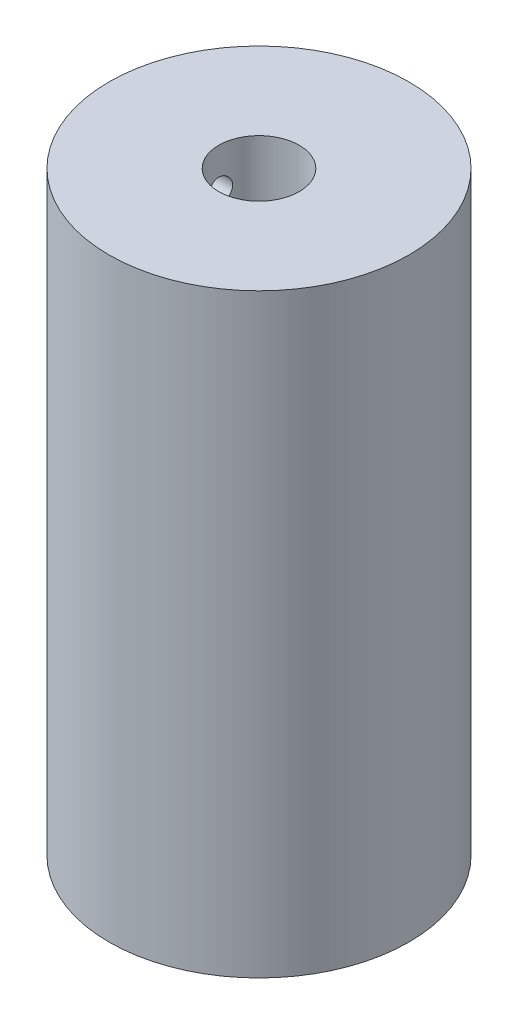
ISO-10303-21;
HEADER;
FILE_DESCRIPTION(('STEP AP214'),'2;1');
FILE_NAME('part.step','',(''),(''),'','','');
FILE_SCHEMA(('AUTOMOTIVE_DESIGN { 1 0 10303 214 1 1 1 1 }'));
ENDSEC;
DATA;
#1=APPLICATION_CONTEXT('core data for automotive mechanical design processes');
#2=APPLICATION_PROTOCOL_DEFINITION('international standard','automotive_design',2000,#1);
#3=PRODUCT_CONTEXT('',#1,'mechanical');
#4=PRODUCT('Part','Part','',(#3));
#5=PRODUCT_RELATED_PRODUCT_CATEGORY('part','',(#4));
#6=PRODUCT_DEFINITION_FORMATION('','',#4);
#7=PRODUCT_DEFINITION_CONTEXT('part definition',#1,'design');
#8=PRODUCT_DEFINITION('design','',#6,#7);
#9=PRODUCT_DEFINITION_SHAPE('','',#8);
#10=(LENGTH_UNIT() NAMED_UNIT(*) SI_UNIT(.MILLI.,.METRE.));
#11=(NAMED_UNIT(*) PLANE_ANGLE_UNIT() SI_UNIT($,.RADIAN.));
#12=(NAMED_UNIT(*) SI_UNIT($,.STERADIAN.) SOLID_ANGLE_UNIT());
#13=UNCERTAINTY_MEASURE_WITH_UNIT(LENGTH_MEASURE(1.E-05),#10,'distance_accuracy_value','');
#14=(GEOMETRIC_REPRESENTATION_CONTEXT(3) GLOBAL_UNCERTAINTY_ASSIGNED_CONTEXT((#13)) GLOBAL_UNIT_ASSIGNED_CONTEXT((#10,
#11,#12)) REPRESENTATION_CONTEXT('',''));
#15=CARTESIAN_POINT('',(0.,0.,0.));
#16=DIRECTION('',(0.,0.,1.));
#17=DIRECTION('',(1.,0.,0.));
#18=AXIS2_PLACEMENT_3D('',#15,#16,#17);
#19=CARTESIAN_POINT('',(0.,41.,0.));
#20=DIRECTION('',(0.,-1.,0.));
#21=DIRECTION('',(0.,0.,-1.));
#22=AXIS2_PLACEMENT_3D('',#19,#20,#21);
#23=CYLINDRICAL_SURFACE('',#22,18.6431118275312);
#24=CARTESIAN_POINT('',(-18.5826698462259,36.0595505754476,-1.5));
#25=CARTESIAN_POINT('',(-18.5826706482539,36.143659799444,-1.49999632137991));
#26=CARTESIAN_POINT('',(-18.5832470379523,36.2278265369809,-1.49290184275366));
#27=CARTESIAN_POINT('',(-18.5854903413188,36.3938319630162,-1.46470464510055));
#28=CARTESIAN_POINT('',(-18.587158495829,36.4756678918712,-1.44358598653252));
#29=CARTESIAN_POINT('',(-18.5913951726797,36.6345833119367,-1.38795450904475));
#30=CARTESIAN_POINT('',(-18.5939631899536,36.7116654428334,-1.35344920249707));
#31=CARTESIAN_POINT('',(-18.5997096077148,36.8589251913361,-1.27203709144946));
#32=CARTESIAN_POINT('',(-18.6028878762356,36.9291042967642,-1.2251329673618));
#33=CARTESIAN_POINT('',(-18.6095052645678,37.0607530816999,-1.12013272489978));
#34=CARTESIAN_POINT('',(-18.6129449253086,37.1222039013569,-1.06201299211818));
#35=CARTESIAN_POINT('',(-18.6196925704556,37.2344898018251,-0.936281172907927));
#36=CARTESIAN_POINT('',(-18.6230005491447,37.2853244221426,-0.86866867492895));
#37=CARTESIAN_POINT('',(-18.6291171823753,37.3749971150423,-0.725758796140489));
#38=CARTESIAN_POINT('',(-18.6319251589255,37.4138189503712,-0.65045119533237));
#39=CARTESIAN_POINT('',(-18.6367195899352,37.4782601953578,-0.494360160383457));
#40=CARTESIAN_POINT('',(-18.6387060579066,37.5038798221606,-0.413576816330362));
#41=CARTESIAN_POINT('',(-18.6416298746976,37.5411353361337,-0.249014502165849));
#42=CARTESIAN_POINT('',(-18.6425695044976,37.5528016306473,-0.165242457185388));
#43=CARTESIAN_POINT('',(-18.6433014975777,37.5619133017621,0.00307565414053751));
#44=CARTESIAN_POINT('',(-18.6430938808929,37.5593589267057,0.0876217069433936));
#45=CARTESIAN_POINT('',(-18.6415566588693,37.5401266670672,0.254881737795371));
#46=CARTESIAN_POINT('',(-18.6402296512523,37.5234814820957,0.337599502976665));
#47=CARTESIAN_POINT('',(-18.6366059152514,37.4765909279254,0.499063275024797));
#48=CARTESIAN_POINT('',(-18.6343091781731,37.446345436788,0.577809246273984));
#49=CARTESIAN_POINT('',(-18.6289999301283,37.3730762936281,0.729198319666572));
#50=CARTESIAN_POINT('',(-18.6259865981191,37.3300379699028,0.801834291053138));
#51=CARTESIAN_POINT('',(-18.6195828712088,37.2324155165484,0.938863662166564));
#52=CARTESIAN_POINT('',(-18.6161924691867,37.1778311688557,1.00325690618057));
#53=CARTESIAN_POINT('',(-18.6094043720801,37.0584817601215,1.12216407390732));
#54=CARTESIAN_POINT('',(-18.6060066835514,36.9936882901629,1.1766494874581));
#55=CARTESIAN_POINT('',(-18.5995966337125,36.8558589706978,1.27397415980091));
#56=CARTESIAN_POINT('',(-18.5965842726894,36.7828231150464,1.31681340991021));
#57=CARTESIAN_POINT('',(-18.5912853460401,36.6305625187955,1.38962847515776));
#58=CARTESIAN_POINT('',(-18.5889988614659,36.5513370882913,1.41960285392201));
#59=CARTESIAN_POINT('',(-18.5854120960407,36.388955618425,1.46581642733687));
#60=CARTESIAN_POINT('',(-18.5841117958798,36.3057996560581,1.4820558909232));
#61=CARTESIAN_POINT('',(-18.5826477073038,36.1381669693119,1.50030265205765));
#62=CARTESIAN_POINT('',(-18.5824807456246,36.0536945969481,1.50234968770205));
#63=CARTESIAN_POINT('',(-18.5832938599946,35.8856078664563,1.49225753729062));
#64=CARTESIAN_POINT('',(-18.584273926081,35.801993500882,1.48011847445325));
#65=CARTESIAN_POINT('',(-18.5872677707752,35.6381101048532,1.44203182040746));
#66=CARTESIAN_POINT('',(-18.5892801638049,35.5578367458734,1.41610273630597));
#67=CARTESIAN_POINT('',(-18.5941107592436,35.4027800192717,1.35119087442304));
#68=CARTESIAN_POINT('',(-18.5969289737191,35.3279967338805,1.31220790116839));
#69=CARTESIAN_POINT('',(-18.6030613588536,35.1858610251872,1.22219413633293));
#70=CARTESIAN_POINT('',(-18.6063766145796,35.1185254337821,1.17113684147485));
#71=CARTESIAN_POINT('',(-18.613125841605,34.9933665537291,1.0584620853356));
#72=CARTESIAN_POINT('',(-18.6165598148092,34.9355434178019,0.996844454542759));
#73=CARTESIAN_POINT('',(-18.6231689743024,34.8309154135654,0.864626510393533));
#74=CARTESIAN_POINT('',(-18.6263435434451,34.7841363480924,0.794005743401145));
#75=CARTESIAN_POINT('',(-18.6320673157884,34.7031013379563,0.64588824658906));
#76=CARTESIAN_POINT('',(-18.6346165248729,34.6688452754639,0.568391581473379));
#77=CARTESIAN_POINT('',(-18.6387994957251,34.6138730772188,0.408814963883985));
#78=CARTESIAN_POINT('',(-18.6404343398737,34.5931409276566,0.326740557485148));
#79=CARTESIAN_POINT('',(-18.642608762092,34.5657527157697,0.160262022317936));
#80=CARTESIAN_POINT('',(-18.6431483593481,34.559096406867,0.0758579343867362));
#81=CARTESIAN_POINT('',(-18.6430715244392,34.560051616264,-0.0926295457182753));
#82=CARTESIAN_POINT('',(-18.6424583524774,34.5676228967938,-0.176713170432667));
#83=CARTESIAN_POINT('',(-18.6401513327504,34.5967345282587,-0.342410624624078));
#84=CARTESIAN_POINT('',(-18.6384574834383,34.6182748991903,-0.424024450565437));
#85=CARTESIAN_POINT('',(-18.6341792091379,34.6747031896352,-0.582468688027212));
#86=CARTESIAN_POINT('',(-18.6315948272922,34.7095904625544,-0.659299331060584));
#87=CARTESIAN_POINT('',(-18.625824775805,34.7917175294604,-0.806019397857401));
#88=CARTESIAN_POINT('',(-18.6226391166075,34.8389571088973,-0.875908942153222));
#89=CARTESIAN_POINT('',(-18.6160134687475,34.9445987318563,-1.00696868451505));
#90=CARTESIAN_POINT('',(-18.6125728183109,35.0030304918337,-1.06811489574877));
#91=CARTESIAN_POINT('',(-18.6058305823151,35.1293454059802,-1.17975582310422));
#92=CARTESIAN_POINT('',(-18.6025290306893,35.1972308491985,-1.23024795205061));
#93=CARTESIAN_POINT('',(-18.5964324360478,35.3406493331855,-1.31921086920486));
#94=CARTESIAN_POINT('',(-18.5936383017349,35.4161957238111,-1.35766017815408));
#95=CARTESIAN_POINT('',(-18.5888840552651,35.5726424646262,-1.42127948705629));
#96=CARTESIAN_POINT('',(-18.5869229819554,35.6535365196248,-1.44646479857753));
#97=CARTESIAN_POINT('',(-18.5845627433914,35.7890172951672,-1.47640633492943));
#98=CARTESIAN_POINT('',(-18.5838561558402,35.8427319459284,-1.48524224814131));
#99=CARTESIAN_POINT('',(-18.5829094485435,35.95080657566,-1.49704026268811));
#100=CARTESIAN_POINT('',(-18.5826693276441,36.0051665530338,-1.50000237855194));
#101=CARTESIAN_POINT('',(-18.5826698462259,36.0595505754476,-1.5));
#102=B_SPLINE_CURVE_WITH_KNOTS('',3,(#24,#25,#26,#27,#28,#29,#30,#31,#32,#33,#34,#35,#36,#37,
#38,#39,#40,#41,#42,#43,#44,#45,#46,#47,#48,#49,#50,#51,#52,#53,#54,#55,#56,#57,#58,#59,#60,#61,
#62,#63,#64,#65,#66,#67,#68,#69,#70,#71,#72,#73,#74,#75,#76,#77,#78,#79,#80,#81,#82,#83,#84,#85,
#86,#87,#88,#89,#90,#91,#92,#93,#94,#95,#96,#97,#98,#99,#100,#101),.UNSPECIFIED.,.T.,.F.,(4,2,2,
2,2,2,2,2,2,2,2,2,2,2,2,2,2,2,2,2,2,2,2,2,2,2,2,2,2,2,2,2,2,2,2,2,2,2,4),(0.,0.252129110575319,
0.504545276543594,0.756819995032623,1.00904022058063,1.26179740580186,1.51456555246978,
1.76767387927873,2.02077804292404,2.27332962672719,2.52587680011592,2.77783950552403,
3.02980447004342,3.28205952770044,3.53431934998896,3.78729395325183,4.04026874511798,
4.29327177449526,4.54626984984662,4.79855925598449,5.05084647078838,5.30279595096958,
5.5547492040936,5.80726071654076,6.05977628261461,6.3128761013666,6.56597353863505,
6.81877073387677,7.07156350062688,7.32364240707507,7.57572167437185,7.82778873116729,
8.07985141004556,8.33259285981231,8.58539561338821,8.8386467250353,9.09160484669105,
9.25462892972958,9.41765260952585),.UNSPECIFIED.);
#103=CARTESIAN_POINT('',(-18.5826698462259,36.0595505754476,-1.5));
#104=VERTEX_POINT('',#103);
#105=EDGE_CURVE('E63',#104,#104,#102,.T.);
#106=ORIENTED_EDGE('',*,*,#105,.T.);
#107=EDGE_LOOP('',(#106));
#108=FACE_BOUND('',#107,.T.);
#109=CARTESIAN_POINT('',(0.,41.,0.));
#110=DIRECTION('',(0.,1.,0.));
#111=DIRECTION('',(0.,0.,1.));
#112=AXIS2_PLACEMENT_3D('',#109,#110,#111);
#113=CIRCLE('',#112,18.6431118275312);
#114=CARTESIAN_POINT('',(0.,41.,18.6431118275312));
#115=VERTEX_POINT('',#114);
#116=EDGE_CURVE('E10',#115,#115,#113,.T.);
#117=ORIENTED_EDGE('',*,*,#116,.F.);
#118=EDGE_LOOP('',(#117));
#119=FACE_BOUND('',#118,.T.);
#120=CARTESIAN_POINT('',(0.,-33.,0.));
#121=DIRECTION('',(0.,-1.,0.));
#122=DIRECTION('',(0.,0.,-1.));
#123=AXIS2_PLACEMENT_3D('',#120,#121,#122);
#124=CIRCLE('',#123,18.6431118275312);
#125=CARTESIAN_POINT('',(0.,-33.,-18.6431118275312));
#126=VERTEX_POINT('',#125);
#127=EDGE_CURVE('E64',#126,#126,#124,.T.);
#128=ORIENTED_EDGE('',*,*,#127,.F.);
#129=EDGE_LOOP('',(#128));
#130=FACE_BOUND('',#129,.T.);
#131=ADVANCED_FACE('F37',(#108,#119,#130),#23,.T.);
#132=CARTESIAN_POINT('',(0.,41.,0.));
#133=DIRECTION('',(0.,1.,0.));
#134=DIRECTION('',(0.,0.,1.));
#135=AXIS2_PLACEMENT_3D('',#132,#133,#134);
#136=PLANE('',#135);
#137=CARTESIAN_POINT('',(0.,41.,0.));
#138=DIRECTION('',(0.,1.,0.));
#139=DIRECTION('',(0.,0.,1.));
#140=AXIS2_PLACEMENT_3D('',#137,#138,#139);
#141=CIRCLE('',#140,5.);
#142=CARTESIAN_POINT('',(0.,41.,5.));
#143=VERTEX_POINT('',#142);
#144=EDGE_CURVE('E52',#143,#143,#141,.T.);
#145=ORIENTED_EDGE('',*,*,#144,.F.);
#146=EDGE_LOOP('',(#145));
#147=FACE_BOUND('',#146,.T.);
#148=ORIENTED_EDGE('',*,*,#116,.T.);
#149=EDGE_LOOP('',(#148));
#150=FACE_BOUND('',#149,.T.);
#151=ADVANCED_FACE('F108',(#147,#150),#136,.T.);
#152=CARTESIAN_POINT('',(0.,31.,0.));
#153=DIRECTION('',(0.,1.,0.));
#154=DIRECTION('',(0.,0.,1.));
#155=AXIS2_PLACEMENT_3D('',#152,#153,#154);
#156=CYLINDRICAL_SURFACE('',#155,5.);
#157=CARTESIAN_POINT('',(-4.76969600708473,36.0595505754476,-1.5));
#158=CARTESIAN_POINT('',(-4.7696968572698,35.9773560275052,-1.49999897633764));
#159=CARTESIAN_POINT('',(-4.77184390209069,35.8951513513035,-1.49322108167142));
#160=CARTESIAN_POINT('',(-4.780165783029,35.7331453258556,-1.46635844446749));
#161=CARTESIAN_POINT('',(-4.78634196493468,35.6533447889461,-1.44626925573578));
#162=CARTESIAN_POINT('',(-4.80196102485632,35.4985158471758,-1.39352753269955));
#163=CARTESIAN_POINT('',(-4.81139846703232,35.4234797458145,-1.36089589394243));
#164=CARTESIAN_POINT('',(-4.83246932547567,35.2799286414523,-1.28406421917929));
#165=CARTESIAN_POINT('',(-4.84410307041019,35.2114146167631,-1.23986245137053));
#166=CARTESIAN_POINT('',(-4.86866862185765,35.0806841848702,-1.13964754141627));
#167=CARTESIAN_POINT('',(-4.88162808311636,35.0187046775013,-1.08333207175807));
#168=CARTESIAN_POINT('',(-4.90714861936757,34.9049126241251,-0.9611362375796));
#169=CARTESIAN_POINT('',(-4.91970964297705,34.8531013849977,-0.895254645461112));
#170=CARTESIAN_POINT('',(-4.94333214579389,34.7600878756142,-0.75411143779369));
#171=CARTESIAN_POINT('',(-4.95435724342404,34.7191271510047,-0.678684021335814));
#172=CARTESIAN_POINT('',(-4.97334435920684,34.6505633164048,-0.521624645369353));
#173=CARTESIAN_POINT('',(-4.98130703789495,34.6229573255901,-0.439994028387912));
#174=CARTESIAN_POINT('',(-4.99307646003589,34.5826705743571,-0.27532385263083));
#175=CARTESIAN_POINT('',(-4.99699557369338,34.5695854477949,-0.1923913989538));
#176=CARTESIAN_POINT('',(-5.00063201501348,34.5574332508011,-0.0254218237493139));
#177=CARTESIAN_POINT('',(-5.00035022521079,34.5583632360456,0.0586150620503695));
#178=CARTESIAN_POINT('',(-4.99569603817658,34.5739434439906,0.222571156600162));
#179=CARTESIAN_POINT('',(-4.9914542020526,34.5881557692574,0.302536267641343));
#180=CARTESIAN_POINT('',(-4.97951522112593,34.6291819114418,0.458889213442527));
#181=CARTESIAN_POINT('',(-4.97181785750586,34.6559965263902,0.535276821322846));
#182=CARTESIAN_POINT('',(-4.95365220986963,34.7217625988661,0.683347326351281));
#183=CARTESIAN_POINT('',(-4.94315269676706,34.7608517782548,0.754965064694479));
#184=CARTESIAN_POINT('',(-4.92049640648069,34.8499484278758,0.890764673783157));
#185=CARTESIAN_POINT('',(-4.90833923637778,34.899958488411,0.954944774872132));
#186=CARTESIAN_POINT('',(-4.88311550488166,35.0117483261992,1.0766604815298));
#187=CARTESIAN_POINT('',(-4.87003195321461,35.0739074944773,1.13384458040112));
#188=CARTESIAN_POINT('',(-4.84483979887497,35.2070605933376,1.23707651539824));
#189=CARTESIAN_POINT('',(-4.8327312931702,35.2780554008368,1.28312324482852));
#190=CARTESIAN_POINT('',(-4.81077903197678,35.4277900446966,1.3631399533545));
#191=CARTESIAN_POINT('',(-4.80095810695957,35.5065976213105,1.39698989237679));
#192=CARTESIAN_POINT('',(-4.78496392548436,35.6691577838931,1.45083362878413));
#193=CARTESIAN_POINT('',(-4.7787894791583,35.7529087469821,1.4708319464056));
#194=CARTESIAN_POINT('',(-4.77104849541241,35.9196329361868,1.49574770282165));
#195=CARTESIAN_POINT('',(-4.7693187867044,36.0025187993415,1.50119946380212));
#196=CARTESIAN_POINT('',(-4.77021192441924,36.1680234754574,1.49835947233062));
#197=CARTESIAN_POINT('',(-4.77283416156589,36.2506423241784,1.4900696437133));
#198=CARTESIAN_POINT('',(-4.78197558554912,36.4110389534184,1.4604576357419));
#199=CARTESIAN_POINT('',(-4.78839176507489,36.4888867397111,1.4394796143128));
#200=CARTESIAN_POINT('',(-4.80429141231227,36.6399522662625,1.3854857774794));
#201=CARTESIAN_POINT('',(-4.81377535359073,36.7131692895881,1.3524681034276));
#202=CARTESIAN_POINT('',(-4.83505835023047,36.8550680395197,1.27431871196501));
#203=CARTESIAN_POINT('',(-4.84691271069799,36.9235752964333,1.22888564172729));
#204=CARTESIAN_POINT('',(-4.87148205646987,37.0521886816284,1.12755301600385));
#205=CARTESIAN_POINT('',(-4.88419724730003,37.1122927930603,1.07165095534897));
#206=CARTESIAN_POINT('',(-4.90963633548158,37.2247309812623,0.948455132493601));
#207=CARTESIAN_POINT('',(-4.92234245063004,37.2766862044345,0.880811065857436));
#208=CARTESIAN_POINT('',(-4.94584851748651,37.3685172764753,0.73746178459025));
#209=CARTESIAN_POINT('',(-4.95664856384717,37.408393725229,0.661756970543944));
#210=CARTESIAN_POINT('',(-4.97505970474957,37.4745506060159,0.504935504705222));
#211=CARTESIAN_POINT('',(-4.98269453424966,37.5009325916065,0.423864622037839));
#212=CARTESIAN_POINT('',(-4.99401979596827,37.539611494338,0.258169966504589));
#213=CARTESIAN_POINT('',(-4.9977113567088,37.551912441396,0.173547217354763));
#214=CARTESIAN_POINT('',(-5.00066544081399,37.5617736195021,0.00665215388274284));
#215=CARTESIAN_POINT('',(-5.00009305111322,37.5598832708554,-0.0755851790862069));
#216=CARTESIAN_POINT('',(-4.99497264465037,37.5427289429484,-0.238519481164404));
#217=CARTESIAN_POINT('',(-4.99042485330463,37.5274657219671,-0.319216537346529));
#218=CARTESIAN_POINT('',(-4.97791168358327,37.4843389140479,-0.475935813041359));
#219=CARTESIAN_POINT('',(-4.96998352900866,37.4566123947985,-0.551998927351393));
#220=CARTESIAN_POINT('',(-4.9515294303945,37.3894686609404,-0.698433237752054));
#221=CARTESIAN_POINT('',(-4.94100305949946,37.3500495251614,-0.76880349605058));
#222=CARTESIAN_POINT('',(-4.91803965828228,37.2591771180175,-0.904301892420565));
#223=CARTESIAN_POINT('',(-4.90555226923559,37.2073791454468,-0.96919025007677));
#224=CARTESIAN_POINT('',(-4.88023537212334,37.0938401871148,-1.08953757134595));
#225=CARTESIAN_POINT('',(-4.86740576641079,37.0320963375494,-1.14499380960194));
#226=CARTESIAN_POINT('',(-4.84240680631319,36.898209797137,-1.24656269394549));
#227=CARTESIAN_POINT('',(-4.83026852693485,36.8258120220571,-1.29234759757956));
#228=CARTESIAN_POINT('',(-4.80852547508793,36.6739954012865,-1.37104313528776));
#229=CARTESIAN_POINT('',(-4.79891948596955,36.5945799518464,-1.40395995557289));
#230=CARTESIAN_POINT('',(-4.78427816717595,36.4398101438413,-1.45301942532949));
#231=CARTESIAN_POINT('',(-4.7788615484052,36.3649419285166,-1.47058859011231));
#232=CARTESIAN_POINT('',(-4.77157042597167,36.2132353529518,-1.49407818835144));
#233=CARTESIAN_POINT('',(-4.7696952122143,36.1363973908023,-1.50000095706095));
#234=CARTESIAN_POINT('',(-4.76969600708473,36.0595505754476,-1.5));
#235=B_SPLINE_CURVE_WITH_KNOTS('',3,(#157,#158,#159,#160,#161,#162,#163,#164,#165,#166,#167,
#168,#169,#170,#171,#172,#173,#174,#175,#176,#177,#178,#179,#180,#181,#182,#183,#184,#185,#186,
#187,#188,#189,#190,#191,#192,#193,#194,#195,#196,#197,#198,#199,#200,#201,#202,#203,#204,#205,
#206,#207,#208,#209,#210,#211,#212,#213,#214,#215,#216,#217,#218,#219,#220,#221,#222,#223,#224,
#225,#226,#227,#228,#229,#230,#231,#232,#233,#234),.UNSPECIFIED.,.T.,.F.,(4,2,2,2,2,2,2,2,2,2,2,
2,2,2,2,2,2,2,2,2,2,2,2,2,2,2,2,2,2,2,2,2,2,2,2,2,2,2,4),(0.,0.246300165915542,
0.492682641689001,0.738656414466191,0.984667025370097,1.23773150007984,1.49082847871273,
1.74915939273645,2.00743455587877,2.25832140149558,2.50915554101441,2.7520012599088,
2.99486235890376,3.24055209335676,3.48630016590831,3.74152147023278,3.99676812491863,
4.25446238246266,4.51207250628411,4.7600808079031,5.00805439107388,5.24958594938817,
5.49115481045787,5.73920731809388,5.98731925928923,6.24479506100602,6.50225807324202,
6.75775391814325,7.01317662321682,7.2587630391122,7.50433553047755,7.74727096872219,
7.99024634491379,8.24099627054489,8.49181852629891,8.75011639669147,9.00828993963944,
9.23861153857447,9.46888695033561),.UNSPECIFIED.);
#236=CARTESIAN_POINT('',(-4.76969600708473,36.0595505754476,-1.5));
#237=VERTEX_POINT('',#236);
#238=EDGE_CURVE('E55',#237,#237,#235,.T.);
#239=ORIENTED_EDGE('',*,*,#238,.T.);
#240=EDGE_LOOP('',(#239));
#241=FACE_BOUND('',#240,.T.);
#242=CARTESIAN_POINT('',(0.,31.,0.));
#243=DIRECTION('',(0.,1.,0.));
#244=DIRECTION('',(0.,0.,1.));
#245=AXIS2_PLACEMENT_3D('',#242,#243,#244);
#246=CIRCLE('',#245,5.);
#247=CARTESIAN_POINT('',(0.,31.,5.));
#248=VERTEX_POINT('',#247);
#249=EDGE_CURVE('E46',#248,#248,#246,.T.);
#250=ORIENTED_EDGE('',*,*,#249,.F.);
#251=EDGE_LOOP('',(#250));
#252=FACE_BOUND('',#251,.T.);
#253=ORIENTED_EDGE('',*,*,#144,.T.);
#254=EDGE_LOOP('',(#253));
#255=FACE_BOUND('',#254,.T.);
#256=ADVANCED_FACE('F65',(#241,#252,#255),#156,.F.);
#257=CARTESIAN_POINT('',(0.,31.,0.));
#258=DIRECTION('',(0.,1.,0.));
#259=DIRECTION('',(0.,0.,1.));
#260=AXIS2_PLACEMENT_3D('',#257,#258,#259);
#261=PLANE('',#260);
#262=ORIENTED_EDGE('',*,*,#249,.T.);
#263=EDGE_LOOP('',(#262));
#264=FACE_BOUND('',#263,.T.);
#265=ADVANCED_FACE('F73',(#264),#261,.T.);
#266=CARTESIAN_POINT('',(-25.,36.0595505754476,0.));
#267=DIRECTION('',(1.,0.,0.));
#268=DIRECTION('',(0.,0.,-1.));
#269=AXIS2_PLACEMENT_3D('',#266,#267,#268);
#270=CYLINDRICAL_SURFACE('',#269,1.5);
#271=ORIENTED_EDGE('',*,*,#238,.F.);
#272=EDGE_LOOP('',(#271));
#273=FACE_BOUND('',#272,.T.);
#274=ORIENTED_EDGE('',*,*,#105,.F.);
#275=EDGE_LOOP('',(#274));
#276=FACE_BOUND('',#275,.T.);
#277=ADVANCED_FACE('F68',(#273,#276),#270,.F.);
#278=CARTESIAN_POINT('',(0.,-33.,0.));
#279=DIRECTION('',(0.,-1.,0.));
#280=DIRECTION('',(0.,0.,-1.));
#281=AXIS2_PLACEMENT_3D('',#278,#279,#280);
#282=PLANE('',#281);
#283=CARTESIAN_POINT('',(0.,-33.,0.));
#284=DIRECTION('',(0.,-1.,0.));
#285=DIRECTION('',(0.,0.,-1.));
#286=AXIS2_PLACEMENT_3D('',#283,#284,#285);
#287=CIRCLE('',#286,5.);
#288=CARTESIAN_POINT('',(0.,-33.,-5.));
#289=VERTEX_POINT('',#288);
#290=EDGE_CURVE('E41',#289,#289,#287,.F.);
#291=ORIENTED_EDGE('',*,*,#290,.T.);
#292=EDGE_LOOP('',(#291));
#293=FACE_BOUND('',#292,.T.);
#294=ORIENTED_EDGE('',*,*,#127,.T.);
#295=EDGE_LOOP('',(#294));
#296=FACE_BOUND('',#295,.T.);
#297=ADVANCED_FACE('F72',(#293,#296),#282,.T.);
#298=CARTESIAN_POINT('',(0.,-92.0000000000001,0.));
#299=DIRECTION('',(0.,1.,0.));
#300=DIRECTION('',(0.,0.,1.));
#301=AXIS2_PLACEMENT_3D('',#298,#299,#300);
#302=CYLINDRICAL_SURFACE('',#301,5.);
#303=ORIENTED_EDGE('',*,*,#290,.F.);
#304=EDGE_LOOP('',(#303));
#305=FACE_BOUND('',#304,.T.);
#306=CARTESIAN_POINT('',(0.,0.,0.));
#307=DIRECTION('',(0.,-1.,0.));
#308=DIRECTION('',(0.,0.,-1.));
#309=AXIS2_PLACEMENT_3D('',#306,#307,#308);
#310=CIRCLE('',#309,5.);
#311=CARTESIAN_POINT('',(0.,0.,-5.));
#312=VERTEX_POINT('',#311);
#313=EDGE_CURVE('E87',#312,#312,#310,.T.);
#314=ORIENTED_EDGE('',*,*,#313,.F.);
#315=EDGE_LOOP('',(#314));
#316=FACE_BOUND('',#315,.T.);
#317=ADVANCED_FACE('F98',(#305,#316),#302,.F.);
#318=CARTESIAN_POINT('',(0.,0.,0.));
#319=DIRECTION('',(0.,-1.,0.));
#320=DIRECTION('',(0.,0.,-1.));
#321=AXIS2_PLACEMENT_3D('',#318,#319,#320);
#322=PLANE('',#321);
#323=ORIENTED_EDGE('',*,*,#313,.T.);
#324=EDGE_LOOP('',(#323));
#325=FACE_BOUND('',#324,.T.);
#326=ADVANCED_FACE('F101',(#325),#322,.T.);
#327=CLOSED_SHELL('',(#131,#151,#256,#265,#277,#297,#317,#326));
#328=MANIFOLD_SOLID_BREP('B2',#327);
#329=ADVANCED_BREP_SHAPE_REPRESENTATION('',(#18,#328),#14);
#330=SHAPE_DEFINITION_REPRESENTATION(#9,#329);
ENDSEC;
END-ISO-10303-21;
